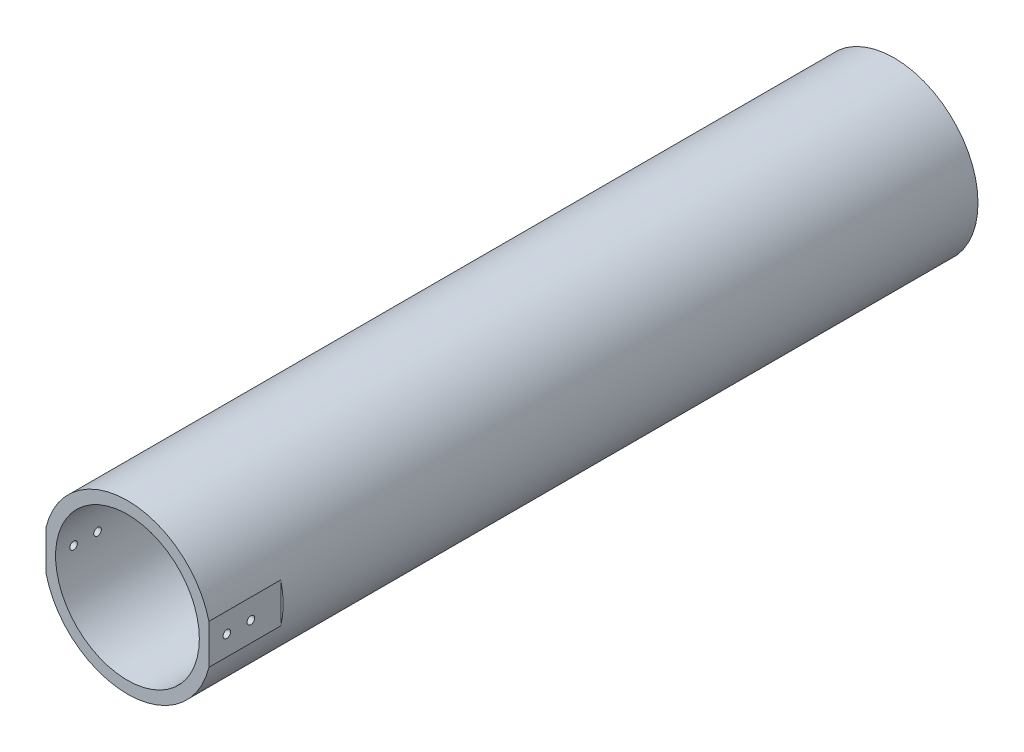
ISO-10303-21;
HEADER;
FILE_DESCRIPTION(('STEP AP214'),'2;1');
FILE_NAME('part.step','',(''),(''),'','','');
FILE_SCHEMA(('AUTOMOTIVE_DESIGN { 1 0 10303 214 1 1 1 1 }'));
ENDSEC;
DATA;
#1=APPLICATION_CONTEXT('core data for automotive mechanical design processes');
#2=APPLICATION_PROTOCOL_DEFINITION('international standard','automotive_design',2000,#1);
#3=PRODUCT_CONTEXT('',#1,'mechanical');
#4=PRODUCT('Part','Part','',(#3));
#5=PRODUCT_RELATED_PRODUCT_CATEGORY('part','',(#4));
#6=PRODUCT_DEFINITION_FORMATION('','',#4);
#7=PRODUCT_DEFINITION_CONTEXT('part definition',#1,'design');
#8=PRODUCT_DEFINITION('design','',#6,#7);
#9=PRODUCT_DEFINITION_SHAPE('','',#8);
#10=(LENGTH_UNIT() NAMED_UNIT(*) SI_UNIT(.MILLI.,.METRE.));
#11=(NAMED_UNIT(*) PLANE_ANGLE_UNIT() SI_UNIT($,.RADIAN.));
#12=(NAMED_UNIT(*) SI_UNIT($,.STERADIAN.) SOLID_ANGLE_UNIT());
#13=UNCERTAINTY_MEASURE_WITH_UNIT(LENGTH_MEASURE(1.E-05),#10,'distance_accuracy_value','');
#14=(GEOMETRIC_REPRESENTATION_CONTEXT(3) GLOBAL_UNCERTAINTY_ASSIGNED_CONTEXT((#13)) GLOBAL_UNIT_ASSIGNED_CONTEXT((#10,
#11,#12)) REPRESENTATION_CONTEXT('',''));
#15=CARTESIAN_POINT('',(0.,0.,0.));
#16=DIRECTION('',(0.,0.,1.));
#17=DIRECTION('',(1.,0.,0.));
#18=AXIS2_PLACEMENT_3D('',#15,#16,#17);
#19=CARTESIAN_POINT('',(0.,0.,203.2));
#20=DIRECTION('',(0.,0.,1.));
#21=DIRECTION('',(1.,0.,0.));
#22=AXIS2_PLACEMENT_3D('',#19,#20,#21);
#23=PLANE('',#22);
#24=CARTESIAN_POINT('',(0.,0.,203.2));
#25=DIRECTION('',(0.,0.,1.));
#26=DIRECTION('',(1.,0.,0.));
#27=AXIS2_PLACEMENT_3D('',#24,#25,#26);
#28=CIRCLE('',#27,38.1);
#29=CARTESIAN_POINT('',(38.1,0.,203.2));
#30=VERTEX_POINT('',#29);
#31=EDGE_CURVE('E122',#30,#30,#28,.T.);
#32=ORIENTED_EDGE('',*,*,#31,.F.);
#33=EDGE_LOOP('',(#32));
#34=FACE_BOUND('',#33,.T.);
#35=CARTESIAN_POINT('',(0.,0.,203.2));
#36=DIRECTION('',(0.,0.,1.));
#37=DIRECTION('',(1.,0.,0.));
#38=AXIS2_PLACEMENT_3D('',#35,#36,#37);
#39=CIRCLE('',#38,44.45);
#40=CARTESIAN_POINT('',(43.18,10.549412305906,203.2));
#41=VERTEX_POINT('',#40);
#42=CARTESIAN_POINT('',(-43.18,10.549412305906,203.2));
#43=VERTEX_POINT('',#42);
#44=EDGE_CURVE('E106',#41,#43,#39,.T.);
#45=ORIENTED_EDGE('',*,*,#44,.T.);
#46=DIRECTION('',(0.,-1.,0.));
#47=VECTOR('',#46,1.);
#48=CARTESIAN_POINT('',(-43.18,13.8245684323001,203.2));
#49=LINE('',#48,#47);
#50=CARTESIAN_POINT('',(-43.18,-10.5494123059059,203.2));
#51=VERTEX_POINT('',#50);
#52=EDGE_CURVE('E93',#43,#51,#49,.T.);
#53=ORIENTED_EDGE('',*,*,#52,.T.);
#54=CARTESIAN_POINT('',(43.18,-10.5494123059059,203.2));
#55=VERTEX_POINT('',#54);
#56=EDGE_CURVE('E112',#51,#55,#39,.T.);
#57=ORIENTED_EDGE('',*,*,#56,.T.);
#58=DIRECTION('',(0.,-1.,0.));
#59=VECTOR('',#58,1.);
#60=CARTESIAN_POINT('',(43.18,13.8245684323001,203.2));
#61=LINE('',#60,#59);
#62=EDGE_CURVE('E110',#41,#55,#61,.T.);
#63=ORIENTED_EDGE('',*,*,#62,.F.);
#64=EDGE_LOOP('',(#45,#53,#57,#63));
#65=FACE_BOUND('',#64,.T.);
#66=ADVANCED_FACE('F36',(#34,#65),#23,.T.);
#67=CARTESIAN_POINT('',(0.,0.,203.2));
#68=DIRECTION('',(0.,0.,-1.));
#69=DIRECTION('',(-1.,0.,0.));
#70=AXIS2_PLACEMENT_3D('',#67,#68,#69);
#71=CYLINDRICAL_SURFACE('',#70,44.45);
#72=CARTESIAN_POINT('',(0.,0.,-203.2));
#73=DIRECTION('',(0.,0.,1.));
#74=DIRECTION('',(1.,0.,0.));
#75=AXIS2_PLACEMENT_3D('',#72,#73,#74);
#76=CIRCLE('',#75,44.45);
#77=CARTESIAN_POINT('',(44.45,0.,-203.2));
#78=VERTEX_POINT('',#77);
#79=EDGE_CURVE('E116',#78,#78,#76,.T.);
#80=ORIENTED_EDGE('',*,*,#79,.T.);
#81=EDGE_LOOP('',(#80));
#82=FACE_BOUND('',#81,.T.);
#83=DIRECTION('',(0.,0.,-1.));
#84=VECTOR('',#83,1.);
#85=CARTESIAN_POINT('',(-43.18,10.549412305906,203.2));
#86=LINE('',#85,#84);
#87=CARTESIAN_POINT('',(-43.18,10.549412305906,165.1));
#88=VERTEX_POINT('',#87);
#89=EDGE_CURVE('E11',#43,#88,#86,.T.);
#90=ORIENTED_EDGE('',*,*,#89,.F.);
#91=ORIENTED_EDGE('',*,*,#44,.F.);
#92=DIRECTION('',(0.,0.,-1.));
#93=VECTOR('',#92,1.);
#94=CARTESIAN_POINT('',(43.18,10.549412305906,203.2));
#95=LINE('',#94,#93);
#96=CARTESIAN_POINT('',(43.18,10.549412305906,165.1));
#97=VERTEX_POINT('',#96);
#98=EDGE_CURVE('E126',#41,#97,#95,.T.);
#99=ORIENTED_EDGE('',*,*,#98,.T.);
#100=CARTESIAN_POINT('',(0.,0.,165.1));
#101=DIRECTION('',(0.,0.,1.));
#102=DIRECTION('',(1.,0.,0.));
#103=AXIS2_PLACEMENT_3D('',#100,#101,#102);
#104=CIRCLE('',#103,44.45);
#105=CARTESIAN_POINT('',(43.18,-10.5494123059059,165.1));
#106=VERTEX_POINT('',#105);
#107=EDGE_CURVE('E111',#106,#97,#104,.T.);
#108=ORIENTED_EDGE('',*,*,#107,.F.);
#109=DIRECTION('',(0.,0.,-1.));
#110=VECTOR('',#109,1.);
#111=CARTESIAN_POINT('',(43.18,-10.549412305906,203.2));
#112=LINE('',#111,#110);
#113=EDGE_CURVE('E114',#106,#55,#112,.F.);
#114=ORIENTED_EDGE('',*,*,#113,.T.);
#115=ORIENTED_EDGE('',*,*,#56,.F.);
#116=DIRECTION('',(0.,0.,-1.));
#117=VECTOR('',#116,1.);
#118=CARTESIAN_POINT('',(-43.18,-10.549412305906,203.2));
#119=LINE('',#118,#117);
#120=CARTESIAN_POINT('',(-43.18,-10.5494123059059,165.1));
#121=VERTEX_POINT('',#120);
#122=EDGE_CURVE('E49',#121,#51,#119,.F.);
#123=ORIENTED_EDGE('',*,*,#122,.F.);
#124=CARTESIAN_POINT('',(0.,0.,165.1));
#125=DIRECTION('',(0.,0.,1.));
#126=DIRECTION('',(1.,0.,0.));
#127=AXIS2_PLACEMENT_3D('',#124,#125,#126);
#128=CIRCLE('',#127,44.45);
#129=EDGE_CURVE('E107',#88,#121,#128,.T.);
#130=ORIENTED_EDGE('',*,*,#129,.F.);
#131=EDGE_LOOP('',(#90,#91,#99,#108,#114,#115,#123,#130));
#132=FACE_BOUND('',#131,.T.);
#133=ADVANCED_FACE('F38',(#82,#132),#71,.T.);
#134=CARTESIAN_POINT('',(0.,0.,-203.2));
#135=DIRECTION('',(0.,0.,1.));
#136=DIRECTION('',(1.,0.,0.));
#137=AXIS2_PLACEMENT_3D('',#134,#135,#136);
#138=PLANE('',#137);
#139=CARTESIAN_POINT('',(0.,41.275,-203.2));
#140=DIRECTION('',(0.,0.,-1.));
#141=DIRECTION('',(-1.,0.,0.));
#142=AXIS2_PLACEMENT_3D('',#139,#140,#141);
#143=CIRCLE('',#142,1.7272);
#144=CARTESIAN_POINT('',(-1.7272,41.275,-203.2));
#145=VERTEX_POINT('',#144);
#146=EDGE_CURVE('E178',#145,#145,#143,.T.);
#147=ORIENTED_EDGE('',*,*,#146,.F.);
#148=EDGE_LOOP('',(#147));
#149=FACE_BOUND('',#148,.T.);
#150=CARTESIAN_POINT('',(41.275,0.,-203.2));
#151=DIRECTION('',(0.,0.,-1.));
#152=DIRECTION('',(-1.,0.,0.));
#153=AXIS2_PLACEMENT_3D('',#150,#151,#152);
#154=CIRCLE('',#153,1.7272);
#155=CARTESIAN_POINT('',(39.5478,0.,-203.2));
#156=VERTEX_POINT('',#155);
#157=EDGE_CURVE('E182',#156,#156,#154,.T.);
#158=ORIENTED_EDGE('',*,*,#157,.F.);
#159=EDGE_LOOP('',(#158));
#160=FACE_BOUND('',#159,.T.);
#161=CARTESIAN_POINT('',(-41.275,0.,-203.2));
#162=DIRECTION('',(0.,0.,-1.));
#163=DIRECTION('',(-1.,0.,0.));
#164=AXIS2_PLACEMENT_3D('',#161,#162,#163);
#165=CIRCLE('',#164,1.7272);
#166=CARTESIAN_POINT('',(-43.0022,0.,-203.2));
#167=VERTEX_POINT('',#166);
#168=EDGE_CURVE('E186',#167,#167,#165,.T.);
#169=ORIENTED_EDGE('',*,*,#168,.F.);
#170=EDGE_LOOP('',(#169));
#171=FACE_BOUND('',#170,.T.);
#172=CARTESIAN_POINT('',(0.,-41.275,-203.2));
#173=DIRECTION('',(0.,0.,-1.));
#174=DIRECTION('',(-1.,0.,0.));
#175=AXIS2_PLACEMENT_3D('',#172,#173,#174);
#176=CIRCLE('',#175,1.7272);
#177=CARTESIAN_POINT('',(-1.7272,-41.275,-203.2));
#178=VERTEX_POINT('',#177);
#179=EDGE_CURVE('E190',#178,#178,#176,.T.);
#180=ORIENTED_EDGE('',*,*,#179,.F.);
#181=EDGE_LOOP('',(#180));
#182=FACE_BOUND('',#181,.T.);
#183=ORIENTED_EDGE('',*,*,#79,.F.);
#184=EDGE_LOOP('',(#183));
#185=FACE_BOUND('',#184,.T.);
#186=CARTESIAN_POINT('',(0.,0.,-203.2));
#187=DIRECTION('',(0.,0.,1.));
#188=DIRECTION('',(1.,0.,0.));
#189=AXIS2_PLACEMENT_3D('',#186,#187,#188);
#190=CIRCLE('',#189,38.1);
#191=CARTESIAN_POINT('',(38.1,0.,-203.2));
#192=VERTEX_POINT('',#191);
#193=EDGE_CURVE('E119',#192,#192,#190,.T.);
#194=ORIENTED_EDGE('',*,*,#193,.T.);
#195=EDGE_LOOP('',(#194));
#196=FACE_BOUND('',#195,.T.);
#197=ADVANCED_FACE('F160',(#149,#160,#171,#182,#185,#196),#138,.F.);
#198=CARTESIAN_POINT('',(0.,0.,203.2));
#199=DIRECTION('',(0.,0.,-1.));
#200=DIRECTION('',(-1.,0.,0.));
#201=AXIS2_PLACEMENT_3D('',#198,#199,#200);
#202=CYLINDRICAL_SURFACE('',#201,38.1);
#203=CARTESIAN_POINT('',(-38.1,0.,195.6943));
#204=CARTESIAN_POINT('',(-38.0999992850691,-0.113339598341558,195.694295001201));
#205=CARTESIAN_POINT('',(-38.0994888425181,-0.226759350218026,195.684725632485));
#206=CARTESIAN_POINT('',(-38.0975016581462,-0.450469361691122,195.64668759422));
#207=CARTESIAN_POINT('',(-38.0960237808714,-0.560755784880001,195.618196716395));
#208=CARTESIAN_POINT('',(-38.0922689796549,-0.774926152420234,195.543134249489));
#209=CARTESIAN_POINT('',(-38.0899924661331,-0.878813353161078,195.496571946021));
#210=CARTESIAN_POINT('',(-38.0848967067016,-1.07726933934862,195.386702804082));
#211=CARTESIAN_POINT('',(-38.0820775881113,-1.17184030294376,195.3233998924));
#212=CARTESIAN_POINT('',(-38.0762101748824,-1.34911289859955,195.18176807881));
#213=CARTESIAN_POINT('',(-38.0731616584123,-1.43180281077405,195.103424515795));
#214=CARTESIAN_POINT('',(-38.0671809436644,-1.58286606908075,194.933964831672));
#215=CARTESIAN_POINT('',(-38.0642487501657,-1.65123882747911,194.842848186473));
#216=CARTESIAN_POINT('',(-38.0588297263601,-1.77176033611551,194.650365916223));
#217=CARTESIAN_POINT('',(-38.0563431522437,-1.82389976629031,194.548994447641));
#218=CARTESIAN_POINT('',(-38.0520985250313,-1.91041482567791,194.338921183406));
#219=CARTESIAN_POINT('',(-38.0503404659014,-1.94479060202023,194.230219448476));
#220=CARTESIAN_POINT('',(-38.0477531587118,-1.99477113596519,194.008680593282));
#221=CARTESIAN_POINT('',(-38.0469230311444,-2.01039366921897,193.895847493752));
#222=CARTESIAN_POINT('',(-38.0462825606255,-2.02247910216299,193.669157552349));
#223=CARTESIAN_POINT('',(-38.0464722088574,-2.01894216749902,193.555300719335));
#224=CARTESIAN_POINT('',(-38.047849086287,-1.99282385748571,193.329916176919));
#225=CARTESIAN_POINT('',(-38.0490353091254,-1.97026169407589,193.218386234174));
#226=CARTESIAN_POINT('',(-38.0522700560462,-1.90676316206588,193.000698992353));
#227=CARTESIAN_POINT('',(-38.0543185841079,-1.86582670867355,192.894541718074));
#228=CARTESIAN_POINT('',(-38.0590482211504,-1.76671971997841,192.69055137019));
#229=CARTESIAN_POINT('',(-38.0617296511353,-1.70854043537146,192.592722555103));
#230=CARTESIAN_POINT('',(-38.0674225524442,-1.57660564607159,192.408212698326));
#231=CARTESIAN_POINT('',(-38.0704340264011,-1.50285001711756,192.321531745577));
#232=CARTESIAN_POINT('',(-38.0764520761202,-1.34174782107751,192.161666357165));
#233=CARTESIAN_POINT('',(-38.0794586412745,-1.25438461940654,192.08849868333));
#234=CARTESIAN_POINT('',(-38.0851244424745,-1.06860562701512,191.957866004619));
#235=CARTESIAN_POINT('',(-38.0877836784276,-0.970189833351248,191.900401003926));
#236=CARTESIAN_POINT('',(-38.09245526752,-0.765089434519909,191.802806457075));
#237=CARTESIAN_POINT('',(-38.0944675984227,-0.65840454526926,191.762677506807));
#238=CARTESIAN_POINT('',(-38.0976182737265,-0.439798738584252,191.70090518321));
#239=CARTESIAN_POINT('',(-38.0987566254752,-0.32787786517756,191.679261654474));
#240=CARTESIAN_POINT('',(-38.1000301077694,-0.102122608918278,191.655095237491));
#241=CARTESIAN_POINT('',(-38.1001664546494,0.0117092857633555,191.652549166748));
#242=CARTESIAN_POINT('',(-38.0994237918626,0.238183218599799,191.666589424538));
#243=CARTESIAN_POINT('',(-38.0985447859764,0.350825261183337,191.683175681834));
#244=CARTESIAN_POINT('',(-38.0958711941243,0.57165695930966,191.73499058353));
#245=CARTESIAN_POINT('',(-38.094077128595,0.67984910795567,191.770208631596));
#246=CARTESIAN_POINT('',(-38.0897753717232,0.888786672846725,191.858276657001));
#247=CARTESIAN_POINT('',(-38.087267675762,0.989532040889083,191.911126748459));
#248=CARTESIAN_POINT('',(-38.0818176581651,1.18082263710925,192.033017919383));
#249=CARTESIAN_POINT('',(-38.0788749207205,1.27135795904121,192.102074526408));
#250=CARTESIAN_POINT('',(-38.0728875669007,1.43955886696758,192.254395797363));
#251=CARTESIAN_POINT('',(-38.0698429497955,1.51722436072653,192.337660563112));
#252=CARTESIAN_POINT('',(-38.0639915118404,1.6575591284657,192.516134363348));
#253=CARTESIAN_POINT('',(-38.0611849307725,1.72021339434525,192.611355207701));
#254=CARTESIAN_POINT('',(-38.0561298341766,1.82864458936572,192.810978594158));
#255=CARTESIAN_POINT('',(-38.0538813159958,1.87442159872944,192.915381092617));
#256=CARTESIAN_POINT('',(-38.0501976197549,1.9477727096827,193.130348754239));
#257=CARTESIAN_POINT('',(-38.0487620154476,1.97535635212098,193.240910654286));
#258=CARTESIAN_POINT('',(-38.0468648421462,2.01156892567901,193.465104261071));
#259=CARTESIAN_POINT('',(-38.0464032667155,2.02019798205549,193.578735947519));
#260=CARTESIAN_POINT('',(-38.0465063599807,2.01825525459383,193.805694192574));
#261=CARTESIAN_POINT('',(-38.0470697669808,2.00770707686366,193.919020954578));
#262=CARTESIAN_POINT('',(-38.0491566596073,1.96775813502292,194.142292133366));
#263=CARTESIAN_POINT('',(-38.0506801470457,1.93835733533142,194.252236543766));
#264=CARTESIAN_POINT('',(-38.054515206927,1.8615426809272,194.465626690055));
#265=CARTESIAN_POINT('',(-38.056826783037,1.81412874239481,194.569072395702));
#266=CARTESIAN_POINT('',(-38.0619774305164,1.70263754510725,194.766537042002));
#267=CARTESIAN_POINT('',(-38.0648164862557,1.63856078007297,194.860556261848));
#268=CARTESIAN_POINT('',(-38.0707061319727,1.49547744933034,195.036617535547));
#269=CARTESIAN_POINT('',(-38.0737569553201,1.41645424169644,195.118646056272));
#270=CARTESIAN_POINT('',(-38.079724546096,1.24573568504467,195.268298914211));
#271=CARTESIAN_POINT('',(-38.0826412804012,1.15403722711618,195.33591970721));
#272=CARTESIAN_POINT('',(-38.0880142616383,0.960492104206841,195.454873179859));
#273=CARTESIAN_POINT('',(-38.0904700363288,0.858635193928371,195.506189192547));
#274=CARTESIAN_POINT('',(-38.0946375024046,0.64781408265201,195.590929779137));
#275=CARTESIAN_POINT('',(-38.0963500705864,0.538858431954179,195.624375446378));
#276=CARTESIAN_POINT('',(-38.0983861006478,0.357690072859563,195.66367063972));
#277=CARTESIAN_POINT('',(-38.0989886465776,0.286650311697344,195.67514194447));
#278=CARTESIAN_POINT('',(-38.0997958228029,0.143751116171477,195.690458206303));
#279=CARTESIAN_POINT('',(-38.100000453483,0.0718916826000702,195.694303170754));
#280=CARTESIAN_POINT('',(-38.1,0.,195.6943));
#281=B_SPLINE_CURVE_WITH_KNOTS('',3,(#203,#204,#205,#206,#207,#208,#209,#210,#211,#212,#213,
#214,#215,#216,#217,#218,#219,#220,#221,#222,#223,#224,#225,#226,#227,#228,#229,#230,#231,#232,
#233,#234,#235,#236,#237,#238,#239,#240,#241,#242,#243,#244,#245,#246,#247,#248,#249,#250,#251,
#252,#253,#254,#255,#256,#257,#258,#259,#260,#261,#262,#263,#264,#265,#266,#267,#268,#269,#270,
#271,#272,#273,#274,#275,#276,#277,#278,#279,#280),.UNSPECIFIED.,.T.,.F.,(4,2,2,2,2,2,2,2,2,2,2,
2,2,2,2,2,2,2,2,2,2,2,2,2,2,2,2,2,2,2,2,2,2,2,2,2,2,2,4),(0.,0.339756360106963,
0.679912200467916,1.01989348994496,1.35979510175187,1.70002973579934,2.04027833409045,
2.38072192107999,2.72116268826062,3.06128050613094,3.40139538347084,3.74116721882773,
4.0809406221514,4.42088672828459,4.76083554645862,5.10120324488629,5.44157103395733,
5.78195052148523,6.12232714738833,6.46229052149595,6.80225262978592,7.14202160120206,
7.48179277173541,7.82189081773082,8.16199130103488,8.50243040814991,8.84286789703195,
9.1831267136237,9.52338328169171,9.86322129640397,10.2030599525011,10.5429001899723,
10.8827303590975,11.2229411593103,11.5632355529794,11.9038766892382,12.2441148550288,
12.4596236477705,12.6751322322333),.UNSPECIFIED.);
#282=CARTESIAN_POINT('',(-38.1,0.,195.6943));
#283=VERTEX_POINT('',#282);
#284=EDGE_CURVE('E40',#283,#283,#281,.T.);
#285=ORIENTED_EDGE('',*,*,#284,.F.);
#286=EDGE_LOOP('',(#285));
#287=FACE_BOUND('',#286,.T.);
#288=CARTESIAN_POINT('',(-38.1,0.,182.9943));
#289=CARTESIAN_POINT('',(-38.0999992850691,-0.113339598341558,182.994295001201));
#290=CARTESIAN_POINT('',(-38.0994888425181,-0.226759350218026,182.984725632485));
#291=CARTESIAN_POINT('',(-38.0975016581462,-0.450469361691122,182.94668759422));
#292=CARTESIAN_POINT('',(-38.0960237808714,-0.560755784880001,182.918196716395));
#293=CARTESIAN_POINT('',(-38.0922689796549,-0.774926152420234,182.843134249489));
#294=CARTESIAN_POINT('',(-38.0899924661331,-0.878813353161078,182.796571946021));
#295=CARTESIAN_POINT('',(-38.0848967067016,-1.07726933934862,182.686702804082));
#296=CARTESIAN_POINT('',(-38.0820775881113,-1.17184030294376,182.6233998924));
#297=CARTESIAN_POINT('',(-38.0762101748824,-1.34911289859955,182.48176807881));
#298=CARTESIAN_POINT('',(-38.0731616584123,-1.43180281077405,182.403424515795));
#299=CARTESIAN_POINT('',(-38.0671809436644,-1.58286606908075,182.233964831672));
#300=CARTESIAN_POINT('',(-38.0642487501657,-1.65123882747911,182.142848186473));
#301=CARTESIAN_POINT('',(-38.0588297263601,-1.77176033611551,181.950365916223));
#302=CARTESIAN_POINT('',(-38.0563431522437,-1.82389976629031,181.848994447641));
#303=CARTESIAN_POINT('',(-38.0520985250313,-1.91041482567791,181.638921183406));
#304=CARTESIAN_POINT('',(-38.0503404659014,-1.94479060202023,181.530219448476));
#305=CARTESIAN_POINT('',(-38.0477531587118,-1.99477113596519,181.308680593282));
#306=CARTESIAN_POINT('',(-38.0469230311444,-2.01039366921897,181.195847493752));
#307=CARTESIAN_POINT('',(-38.0462825606255,-2.02247910216299,180.969157552349));
#308=CARTESIAN_POINT('',(-38.0464722088574,-2.01894216749902,180.855300719335));
#309=CARTESIAN_POINT('',(-38.047849086287,-1.99282385748571,180.629916176919));
#310=CARTESIAN_POINT('',(-38.0490353091254,-1.97026169407589,180.518386234174));
#311=CARTESIAN_POINT('',(-38.0522700560462,-1.90676316206588,180.300698992353));
#312=CARTESIAN_POINT('',(-38.0543185841079,-1.86582670867355,180.194541718074));
#313=CARTESIAN_POINT('',(-38.0590482211504,-1.76671971997842,179.99055137019));
#314=CARTESIAN_POINT('',(-38.0617296511353,-1.70854043537147,179.892722555103));
#315=CARTESIAN_POINT('',(-38.0674225524442,-1.57660564607161,179.708212698326));
#316=CARTESIAN_POINT('',(-38.0704340264011,-1.50285001711757,179.621531745577));
#317=CARTESIAN_POINT('',(-38.0764520761202,-1.3417478210775,179.461666357165));
#318=CARTESIAN_POINT('',(-38.0794586412745,-1.25438461940654,179.38849868333));
#319=CARTESIAN_POINT('',(-38.0851244424745,-1.06860562701512,179.257866004619));
#320=CARTESIAN_POINT('',(-38.0877836784276,-0.970189833351248,179.200401003926));
#321=CARTESIAN_POINT('',(-38.09245526752,-0.765089434519909,179.102806457075));
#322=CARTESIAN_POINT('',(-38.0944675984227,-0.65840454526926,179.062677506807));
#323=CARTESIAN_POINT('',(-38.0976182737265,-0.439798738584252,179.00090518321));
#324=CARTESIAN_POINT('',(-38.0987566254752,-0.32787786517756,178.979261654474));
#325=CARTESIAN_POINT('',(-38.1000301077694,-0.102122608918278,178.955095237491));
#326=CARTESIAN_POINT('',(-38.1001664546494,0.011709285763355,178.952549166748));
#327=CARTESIAN_POINT('',(-38.0994237918626,0.2381832185998,178.966589424538));
#328=CARTESIAN_POINT('',(-38.0985447859764,0.350825261183339,178.983175681834));
#329=CARTESIAN_POINT('',(-38.0958711941243,0.571656959309664,179.03499058353));
#330=CARTESIAN_POINT('',(-38.094077128595,0.679849107955674,179.070208631596));
#331=CARTESIAN_POINT('',(-38.0897753717232,0.888786672846729,179.158276657001));
#332=CARTESIAN_POINT('',(-38.087267675762,0.989532040889087,179.211126748459));
#333=CARTESIAN_POINT('',(-38.0818176581651,1.18082263710925,179.333017919383));
#334=CARTESIAN_POINT('',(-38.0788749207205,1.27135795904121,179.402074526408));
#335=CARTESIAN_POINT('',(-38.0728875669007,1.43955886696758,179.554395797363));
#336=CARTESIAN_POINT('',(-38.0698429497955,1.51722436072653,179.637660563112));
#337=CARTESIAN_POINT('',(-38.0639915118404,1.6575591284657,179.816134363348));
#338=CARTESIAN_POINT('',(-38.0611849307725,1.72021339434525,179.911355207701));
#339=CARTESIAN_POINT('',(-38.0561298341766,1.82864458936572,180.110978594158));
#340=CARTESIAN_POINT('',(-38.0538813159958,1.87442159872944,180.215381092617));
#341=CARTESIAN_POINT('',(-38.0501976197549,1.9477727096827,180.430348754239));
#342=CARTESIAN_POINT('',(-38.0487620154476,1.97535635212098,180.540910654286));
#343=CARTESIAN_POINT('',(-38.0468648421462,2.01156892567901,180.765104261071));
#344=CARTESIAN_POINT('',(-38.0464032667155,2.02019798205549,180.878735947519));
#345=CARTESIAN_POINT('',(-38.0465063599807,2.01825525459383,181.105694192574));
#346=CARTESIAN_POINT('',(-38.0470697669808,2.00770707686367,181.219020954578));
#347=CARTESIAN_POINT('',(-38.0491566596073,1.96775813502293,181.442292133366));
#348=CARTESIAN_POINT('',(-38.0506801470457,1.93835733533143,181.552236543766));
#349=CARTESIAN_POINT('',(-38.054515206927,1.86154268092721,181.765626690055));
#350=CARTESIAN_POINT('',(-38.056826783037,1.81412874239482,181.869072395702));
#351=CARTESIAN_POINT('',(-38.0619774305164,1.70263754510727,182.066537042002));
#352=CARTESIAN_POINT('',(-38.0648164862557,1.63856078007298,182.160556261848));
#353=CARTESIAN_POINT('',(-38.0707061319727,1.49547744933035,182.336617535547));
#354=CARTESIAN_POINT('',(-38.0737569553201,1.41645424169644,182.418646056272));
#355=CARTESIAN_POINT('',(-38.079724546096,1.24573568504467,182.568298914211));
#356=CARTESIAN_POINT('',(-38.0826412804012,1.15403722711618,182.63591970721));
#357=CARTESIAN_POINT('',(-38.0880142616383,0.960492104206841,182.754873179859));
#358=CARTESIAN_POINT('',(-38.0904700363288,0.858635193928371,182.806189192547));
#359=CARTESIAN_POINT('',(-38.0946375024046,0.64781408265201,182.890929779137));
#360=CARTESIAN_POINT('',(-38.0963500705864,0.538858431954179,182.924375446378));
#361=CARTESIAN_POINT('',(-38.0983861006478,0.357690072859562,182.96367063972));
#362=CARTESIAN_POINT('',(-38.0989886465776,0.286650311697342,182.97514194447));
#363=CARTESIAN_POINT('',(-38.0997958228029,0.143751116171475,182.990458206303));
#364=CARTESIAN_POINT('',(-38.100000453483,0.0718916826000692,182.994303170754));
#365=CARTESIAN_POINT('',(-38.1,0.,182.9943));
#366=B_SPLINE_CURVE_WITH_KNOTS('',3,(#288,#289,#290,#291,#292,#293,#294,#295,#296,#297,#298,
#299,#300,#301,#302,#303,#304,#305,#306,#307,#308,#309,#310,#311,#312,#313,#314,#315,#316,#317,
#318,#319,#320,#321,#322,#323,#324,#325,#326,#327,#328,#329,#330,#331,#332,#333,#334,#335,#336,
#337,#338,#339,#340,#341,#342,#343,#344,#345,#346,#347,#348,#349,#350,#351,#352,#353,#354,#355,
#356,#357,#358,#359,#360,#361,#362,#363,#364,#365),.UNSPECIFIED.,.T.,.F.,(4,2,2,2,2,2,2,2,2,2,2,
2,2,2,2,2,2,2,2,2,2,2,2,2,2,2,2,2,2,2,2,2,2,2,2,2,2,2,4),(0.,0.339756360106963,
0.679912200467916,1.01989348994496,1.35979510175187,1.70002973579934,2.04027833409045,
2.38072192107999,2.72116268826062,3.06128050613094,3.40139538347084,3.74116721882773,
4.0809406221514,4.42088672828456,4.76083554645862,5.10120324488629,5.44157103395733,
5.78195052148523,6.12232714738833,6.46229052149595,6.80225262978592,7.14202160120207,
7.48179277173541,7.82189081773082,8.16199130103487,8.50243040814991,8.84286789703195,
9.1831267136237,9.5233832816917,9.86322129640391,10.2030599525011,10.5429001899723,
10.8827303590975,11.2229411593103,11.5632355529793,11.9038766892382,12.2441148550288,
12.4596236477705,12.6751322322333),.UNSPECIFIED.);
#367=CARTESIAN_POINT('',(-38.1,0.,182.9943));
#368=VERTEX_POINT('',#367);
#369=EDGE_CURVE('E101',#368,#368,#366,.T.);
#370=ORIENTED_EDGE('',*,*,#369,.F.);
#371=EDGE_LOOP('',(#370));
#372=FACE_BOUND('',#371,.T.);
#373=CARTESIAN_POINT('',(38.1,0.,191.6557));
#374=CARTESIAN_POINT('',(38.0999992850691,-0.113339598341547,191.655704998799));
#375=CARTESIAN_POINT('',(38.0994888425181,-0.226759350218015,191.665274367515));
#376=CARTESIAN_POINT('',(38.0975016581462,-0.45046936169111,191.70331240578));
#377=CARTESIAN_POINT('',(38.0960237808714,-0.56075578487999,191.731803283605));
#378=CARTESIAN_POINT('',(38.0922689796549,-0.774926152420224,191.806865750511));
#379=CARTESIAN_POINT('',(38.0899924661331,-0.878813353161067,191.853428053979));
#380=CARTESIAN_POINT('',(38.0848967067016,-1.07726933934862,191.963297195918));
#381=CARTESIAN_POINT('',(38.0820775881113,-1.17184030294376,192.0266001076));
#382=CARTESIAN_POINT('',(38.0762101748824,-1.34911289859954,192.16823192119));
#383=CARTESIAN_POINT('',(38.0731616584123,-1.43180281077402,192.246575484205));
#384=CARTESIAN_POINT('',(38.0671809436644,-1.58286606908072,192.416035168328));
#385=CARTESIAN_POINT('',(38.0642487501657,-1.65123882747909,192.507151813527));
#386=CARTESIAN_POINT('',(38.0588297263601,-1.7717603361155,192.699634083777));
#387=CARTESIAN_POINT('',(38.0563431522437,-1.82389976629031,192.801005552359));
#388=CARTESIAN_POINT('',(38.0520985250313,-1.9104148256779,193.011078816594));
#389=CARTESIAN_POINT('',(38.0503404659014,-1.94479060202023,193.119780551524));
#390=CARTESIAN_POINT('',(38.0477531587118,-1.99477113596519,193.341319406718));
#391=CARTESIAN_POINT('',(38.0469230311444,-2.01039366921897,193.454152506248));
#392=CARTESIAN_POINT('',(38.0462825606255,-2.02247910216299,193.680842447651));
#393=CARTESIAN_POINT('',(38.0464722088574,-2.01894216749902,193.794699280665));
#394=CARTESIAN_POINT('',(38.047849086287,-1.99282385748571,194.020083823081));
#395=CARTESIAN_POINT('',(38.0490353091254,-1.97026169407589,194.131613765826));
#396=CARTESIAN_POINT('',(38.0522700560462,-1.90676316206588,194.349301007647));
#397=CARTESIAN_POINT('',(38.0543185841079,-1.86582670867355,194.455458281926));
#398=CARTESIAN_POINT('',(38.0590482211504,-1.76671971997842,194.65944862981));
#399=CARTESIAN_POINT('',(38.0617296511353,-1.70854043537146,194.757277444897));
#400=CARTESIAN_POINT('',(38.0674225524442,-1.57660564607159,194.941787301674));
#401=CARTESIAN_POINT('',(38.0704340264011,-1.50285001711756,195.028468254423));
#402=CARTESIAN_POINT('',(38.0764520761202,-1.34174782107751,195.188333642835));
#403=CARTESIAN_POINT('',(38.0794586412745,-1.25438461940655,195.26150131667));
#404=CARTESIAN_POINT('',(38.0851244424745,-1.06860562701513,195.392133995381));
#405=CARTESIAN_POINT('',(38.0877836784276,-0.970189833351263,195.449598996074));
#406=CARTESIAN_POINT('',(38.09245526752,-0.76508943451993,195.547193542925));
#407=CARTESIAN_POINT('',(38.0944675984227,-0.658404545269284,195.587322493193));
#408=CARTESIAN_POINT('',(38.0976182737265,-0.439798738584272,195.64909481679));
#409=CARTESIAN_POINT('',(38.0987566254752,-0.327877865177573,195.670738345526));
#410=CARTESIAN_POINT('',(38.1000301077694,-0.102122608918286,195.694904762509));
#411=CARTESIAN_POINT('',(38.1001664546494,0.0117092857633441,195.697450833252));
#412=CARTESIAN_POINT('',(38.0994237918626,0.238183218599788,195.683410575462));
#413=CARTESIAN_POINT('',(38.0985447859764,0.350825261183327,195.666824318166));
#414=CARTESIAN_POINT('',(38.0958711941243,0.571656959309646,195.61500941647));
#415=CARTESIAN_POINT('',(38.094077128595,0.679849107955649,195.579791368404));
#416=CARTESIAN_POINT('',(38.0897753717232,0.888786672846704,195.491723342999));
#417=CARTESIAN_POINT('',(38.087267675762,0.989532040889069,195.438873251541));
#418=CARTESIAN_POINT('',(38.0818176581651,1.18082263710924,195.316982080617));
#419=CARTESIAN_POINT('',(38.0788749207205,1.2713579590412,195.247925473592));
#420=CARTESIAN_POINT('',(38.0728875669007,1.43955886696757,195.095604202637));
#421=CARTESIAN_POINT('',(38.0698429497955,1.51722436072652,195.012339436888));
#422=CARTESIAN_POINT('',(38.0639915118404,1.65755912846569,194.833865636652));
#423=CARTESIAN_POINT('',(38.0611849307725,1.72021339434525,194.738644792299));
#424=CARTESIAN_POINT('',(38.0561298341766,1.82864458936572,194.539021405842));
#425=CARTESIAN_POINT('',(38.0538813159958,1.87442159872944,194.434618907383));
#426=CARTESIAN_POINT('',(38.0501976197549,1.9477727096827,194.219651245761));
#427=CARTESIAN_POINT('',(38.0487620154476,1.97535635212098,194.109089345714));
#428=CARTESIAN_POINT('',(38.0468648421462,2.011568925679,193.884895738929));
#429=CARTESIAN_POINT('',(38.0464032667155,2.02019798205549,193.771264052481));
#430=CARTESIAN_POINT('',(38.0465063599807,2.01825525459383,193.544305807426));
#431=CARTESIAN_POINT('',(38.0470697669808,2.00770707686367,193.430979045422));
#432=CARTESIAN_POINT('',(38.0491566596073,1.96775813502294,193.207707866634));
#433=CARTESIAN_POINT('',(38.0506801470457,1.93835733533144,193.097763456234));
#434=CARTESIAN_POINT('',(38.054515206927,1.86154268092721,192.884373309945));
#435=CARTESIAN_POINT('',(38.056826783037,1.81412874239482,192.780927604298));
#436=CARTESIAN_POINT('',(38.0619774305164,1.70263754510727,192.583462957998));
#437=CARTESIAN_POINT('',(38.0648164862557,1.63856078007298,192.489443738152));
#438=CARTESIAN_POINT('',(38.0707061319727,1.49547744933035,192.313382464453));
#439=CARTESIAN_POINT('',(38.0737569553201,1.41645424169644,192.231353943728));
#440=CARTESIAN_POINT('',(38.079724546096,1.24573568504467,192.081701085789));
#441=CARTESIAN_POINT('',(38.0826412804012,1.15403722711618,192.01408029279));
#442=CARTESIAN_POINT('',(38.0880142616383,0.960492104206845,191.895126820141));
#443=CARTESIAN_POINT('',(38.0904700363288,0.858635193928377,191.843810807453));
#444=CARTESIAN_POINT('',(38.0946375024046,0.647814082652023,191.759070220863));
#445=CARTESIAN_POINT('',(38.0963500705864,0.538858431954196,191.725624553622));
#446=CARTESIAN_POINT('',(38.0983861006478,0.357690072859581,191.68632936028));
#447=CARTESIAN_POINT('',(38.0989886465776,0.286650311697362,191.67485805553));
#448=CARTESIAN_POINT('',(38.0997958228029,0.143751116171491,191.659541793697));
#449=CARTESIAN_POINT('',(38.100000453483,0.0718916826000824,191.655696829245));
#450=CARTESIAN_POINT('',(38.1,0.,191.6557));
#451=B_SPLINE_CURVE_WITH_KNOTS('',3,(#373,#374,#375,#376,#377,#378,#379,#380,#381,#382,#383,
#384,#385,#386,#387,#388,#389,#390,#391,#392,#393,#394,#395,#396,#397,#398,#399,#400,#401,#402,
#403,#404,#405,#406,#407,#408,#409,#410,#411,#412,#413,#414,#415,#416,#417,#418,#419,#420,#421,
#422,#423,#424,#425,#426,#427,#428,#429,#430,#431,#432,#433,#434,#435,#436,#437,#438,#439,#440,
#441,#442,#443,#444,#445,#446,#447,#448,#449,#450),.UNSPECIFIED.,.T.,.F.,(4,2,2,2,2,2,2,2,2,2,2,
2,2,2,2,2,2,2,2,2,2,2,2,2,2,2,2,2,2,2,2,2,2,2,2,2,2,2,4),(0.,0.339756360106961,
0.679912200467916,1.01989348994497,1.35979510175186,1.70002973579931,2.04027833409043,
2.38072192108,2.72116268826063,3.06128050613095,3.40139538347085,3.74116721882774,
4.08094062215141,4.42088672828461,4.76083554645863,5.10120324488629,5.44157103395731,
5.78195052148522,6.12232714738833,6.46229052149595,6.80225262978592,7.14202160120205,
7.4817927717354,7.82189081773081,8.16199130103489,8.50243040814992,8.84286789703197,
9.18312671362369,9.5233832816917,9.86322129640393,10.203059952501,10.5429001899723,
10.8827303590975,11.2229411593103,11.5632355529794,11.9038766892382,12.2441148550288,
12.4596236477705,12.6751322322333),.UNSPECIFIED.);
#452=CARTESIAN_POINT('',(38.1,0.,191.6557));
#453=VERTEX_POINT('',#452);
#454=EDGE_CURVE('E135',#453,#453,#451,.T.);
#455=ORIENTED_EDGE('',*,*,#454,.F.);
#456=EDGE_LOOP('',(#455));
#457=FACE_BOUND('',#456,.T.);
#458=CARTESIAN_POINT('',(38.1,0.,178.9557));
#459=CARTESIAN_POINT('',(38.0999992850691,-0.113339598341547,178.955704998799));
#460=CARTESIAN_POINT('',(38.0994888425181,-0.226759350218015,178.965274367515));
#461=CARTESIAN_POINT('',(38.0975016581462,-0.45046936169111,179.00331240578));
#462=CARTESIAN_POINT('',(38.0960237808714,-0.56075578487999,179.031803283605));
#463=CARTESIAN_POINT('',(38.0922689796549,-0.774926152420224,179.106865750511));
#464=CARTESIAN_POINT('',(38.0899924661331,-0.878813353161067,179.153428053979));
#465=CARTESIAN_POINT('',(38.0848967067016,-1.07726933934862,179.263297195918));
#466=CARTESIAN_POINT('',(38.0820775881113,-1.17184030294376,179.3266001076));
#467=CARTESIAN_POINT('',(38.0762101748824,-1.34911289859954,179.46823192119));
#468=CARTESIAN_POINT('',(38.0731616584123,-1.43180281077402,179.546575484205));
#469=CARTESIAN_POINT('',(38.0671809436644,-1.58286606908072,179.716035168328));
#470=CARTESIAN_POINT('',(38.0642487501657,-1.65123882747909,179.807151813527));
#471=CARTESIAN_POINT('',(38.0588297263601,-1.7717603361155,179.999634083777));
#472=CARTESIAN_POINT('',(38.0563431522437,-1.82389976629031,180.101005552359));
#473=CARTESIAN_POINT('',(38.0520985250313,-1.9104148256779,180.311078816594));
#474=CARTESIAN_POINT('',(38.0503404659014,-1.94479060202023,180.419780551524));
#475=CARTESIAN_POINT('',(38.0477531587118,-1.99477113596519,180.641319406718));
#476=CARTESIAN_POINT('',(38.0469230311444,-2.01039366921897,180.754152506248));
#477=CARTESIAN_POINT('',(38.0462825606255,-2.02247910216299,180.980842447651));
#478=CARTESIAN_POINT('',(38.0464722088574,-2.01894216749902,181.094699280665));
#479=CARTESIAN_POINT('',(38.047849086287,-1.99282385748571,181.320083823081));
#480=CARTESIAN_POINT('',(38.0490353091254,-1.97026169407589,181.431613765826));
#481=CARTESIAN_POINT('',(38.0522700560462,-1.90676316206588,181.649301007647));
#482=CARTESIAN_POINT('',(38.0543185841079,-1.86582670867355,181.755458281926));
#483=CARTESIAN_POINT('',(38.0590482211504,-1.76671971997842,181.95944862981));
#484=CARTESIAN_POINT('',(38.0617296511353,-1.70854043537146,182.057277444897));
#485=CARTESIAN_POINT('',(38.0674225524442,-1.5766056460716,182.241787301674));
#486=CARTESIAN_POINT('',(38.0704340264011,-1.50285001711756,182.328468254423));
#487=CARTESIAN_POINT('',(38.0764520761202,-1.34174782107751,182.488333642835));
#488=CARTESIAN_POINT('',(38.0794586412745,-1.25438461940655,182.56150131667));
#489=CARTESIAN_POINT('',(38.0851244424745,-1.06860562701513,182.692133995381));
#490=CARTESIAN_POINT('',(38.0877836784276,-0.970189833351262,182.749598996074));
#491=CARTESIAN_POINT('',(38.09245526752,-0.765089434519932,182.847193542925));
#492=CARTESIAN_POINT('',(38.0944675984227,-0.658404545269289,182.887322493193));
#493=CARTESIAN_POINT('',(38.0976182737265,-0.439798738584277,182.94909481679));
#494=CARTESIAN_POINT('',(38.0987566254752,-0.327877865177576,182.970738345526));
#495=CARTESIAN_POINT('',(38.1000301077694,-0.102122608918286,182.994904762509));
#496=CARTESIAN_POINT('',(38.1001664546494,0.0117092857633441,182.997450833252));
#497=CARTESIAN_POINT('',(38.0994237918626,0.238183218599788,182.983410575462));
#498=CARTESIAN_POINT('',(38.0985447859764,0.350825261183327,182.966824318166));
#499=CARTESIAN_POINT('',(38.0958711941243,0.571656959309646,182.91500941647));
#500=CARTESIAN_POINT('',(38.094077128595,0.679849107955649,182.879791368404));
#501=CARTESIAN_POINT('',(38.0897753717232,0.888786672846704,182.791723342999));
#502=CARTESIAN_POINT('',(38.087267675762,0.989532040889069,182.738873251541));
#503=CARTESIAN_POINT('',(38.0818176581651,1.18082263710924,182.616982080617));
#504=CARTESIAN_POINT('',(38.0788749207205,1.2713579590412,182.547925473592));
#505=CARTESIAN_POINT('',(38.0728875669007,1.43955886696757,182.395604202637));
#506=CARTESIAN_POINT('',(38.0698429497955,1.51722436072652,182.312339436888));
#507=CARTESIAN_POINT('',(38.0639915118404,1.65755912846569,182.133865636652));
#508=CARTESIAN_POINT('',(38.0611849307725,1.72021339434525,182.038644792299));
#509=CARTESIAN_POINT('',(38.0561298341766,1.82864458936572,181.839021405842));
#510=CARTESIAN_POINT('',(38.0538813159958,1.87442159872944,181.734618907383));
#511=CARTESIAN_POINT('',(38.0501976197549,1.9477727096827,181.519651245761));
#512=CARTESIAN_POINT('',(38.0487620154476,1.97535635212098,181.409089345714));
#513=CARTESIAN_POINT('',(38.0468648421462,2.011568925679,181.184895738929));
#514=CARTESIAN_POINT('',(38.0464032667155,2.02019798205549,181.071264052481));
#515=CARTESIAN_POINT('',(38.0465063599807,2.01825525459383,180.844305807426));
#516=CARTESIAN_POINT('',(38.0470697669808,2.00770707686367,180.730979045422));
#517=CARTESIAN_POINT('',(38.0491566596073,1.96775813502294,180.507707866634));
#518=CARTESIAN_POINT('',(38.0506801470457,1.93835733533144,180.397763456234));
#519=CARTESIAN_POINT('',(38.054515206927,1.86154268092721,180.184373309945));
#520=CARTESIAN_POINT('',(38.056826783037,1.81412874239482,180.080927604298));
#521=CARTESIAN_POINT('',(38.0619774305164,1.70263754510727,179.883462957998));
#522=CARTESIAN_POINT('',(38.0648164862557,1.63856078007298,179.789443738152));
#523=CARTESIAN_POINT('',(38.0707061319727,1.49547744933035,179.613382464453));
#524=CARTESIAN_POINT('',(38.0737569553201,1.41645424169644,179.531353943728));
#525=CARTESIAN_POINT('',(38.079724546096,1.24573568504467,179.381701085789));
#526=CARTESIAN_POINT('',(38.0826412804012,1.15403722711618,179.31408029279));
#527=CARTESIAN_POINT('',(38.0880142616383,0.960492104206845,179.195126820141));
#528=CARTESIAN_POINT('',(38.0904700363288,0.858635193928377,179.143810807453));
#529=CARTESIAN_POINT('',(38.0946375024046,0.647814082652023,179.059070220863));
#530=CARTESIAN_POINT('',(38.0963500705864,0.538858431954196,179.025624553622));
#531=CARTESIAN_POINT('',(38.0983861006478,0.35769007285958,178.98632936028));
#532=CARTESIAN_POINT('',(38.0989886465776,0.28665031169736,178.97485805553));
#533=CARTESIAN_POINT('',(38.0997958228029,0.143751116171489,178.959541793697));
#534=CARTESIAN_POINT('',(38.100000453483,0.0718916826000814,178.955696829246));
#535=CARTESIAN_POINT('',(38.1,0.,178.9557));
#536=B_SPLINE_CURVE_WITH_KNOTS('',3,(#458,#459,#460,#461,#462,#463,#464,#465,#466,#467,#468,
#469,#470,#471,#472,#473,#474,#475,#476,#477,#478,#479,#480,#481,#482,#483,#484,#485,#486,#487,
#488,#489,#490,#491,#492,#493,#494,#495,#496,#497,#498,#499,#500,#501,#502,#503,#504,#505,#506,
#507,#508,#509,#510,#511,#512,#513,#514,#515,#516,#517,#518,#519,#520,#521,#522,#523,#524,#525,
#526,#527,#528,#529,#530,#531,#532,#533,#534,#535),.UNSPECIFIED.,.T.,.F.,(4,2,2,2,2,2,2,2,2,2,2,
2,2,2,2,2,2,2,2,2,2,2,2,2,2,2,2,2,2,2,2,2,2,2,2,2,2,2,4),(0.,0.339756360106961,
0.679912200467916,1.01989348994497,1.35979510175186,1.70002973579931,2.04027833409043,
2.38072192108,2.72116268826063,3.06128050613095,3.40139538347085,3.74116721882774,
4.08094062215141,4.42088672828457,4.76083554645863,5.10120324488629,5.4415710339573,
5.78195052148521,6.12232714738833,6.46229052149595,6.80225262978591,7.14202160120205,
7.4817927717354,7.82189081773081,8.16199130103489,8.50243040814992,8.84286789703197,
9.18312671362369,9.5233832816917,9.86322129640392,10.203059952501,10.5429001899723,
10.8827303590975,11.2229411593103,11.5632355529794,11.9038766892382,12.2441148550288,
12.4596236477705,12.6751322322333),.UNSPECIFIED.);
#537=CARTESIAN_POINT('',(38.1,0.,178.9557));
#538=VERTEX_POINT('',#537);
#539=EDGE_CURVE('E128',#538,#538,#536,.T.);
#540=ORIENTED_EDGE('',*,*,#539,.F.);
#541=EDGE_LOOP('',(#540));
#542=FACE_BOUND('',#541,.T.);
#543=ORIENTED_EDGE('',*,*,#31,.T.);
#544=EDGE_LOOP('',(#543));
#545=FACE_BOUND('',#544,.T.);
#546=ORIENTED_EDGE('',*,*,#193,.F.);
#547=EDGE_LOOP('',(#546));
#548=FACE_BOUND('',#547,.T.);
#549=ADVANCED_FACE('F140',(#287,#372,#457,#542,#545,#548),#202,.F.);
#550=CARTESIAN_POINT('',(43.18,13.8245684323001,165.1));
#551=DIRECTION('',(-1.,0.,0.));
#552=DIRECTION('',(0.,-1.,0.));
#553=AXIS2_PLACEMENT_3D('',#550,#551,#552);
#554=PLANE('',#553);
#555=CARTESIAN_POINT('',(43.18,0.,193.675));
#556=DIRECTION('',(1.,0.,0.));
#557=DIRECTION('',(0.,0.,-1.));
#558=AXIS2_PLACEMENT_3D('',#555,#556,#557);
#559=CIRCLE('',#558,2.0193);
#560=CARTESIAN_POINT('',(43.18,0.,191.6557));
#561=VERTEX_POINT('',#560);
#562=EDGE_CURVE('E202',#561,#561,#559,.T.);
#563=ORIENTED_EDGE('',*,*,#562,.F.);
#564=EDGE_LOOP('',(#563));
#565=FACE_BOUND('',#564,.T.);
#566=CARTESIAN_POINT('',(43.18,0.,180.975));
#567=DIRECTION('',(1.,0.,0.));
#568=DIRECTION('',(0.,0.,-1.));
#569=AXIS2_PLACEMENT_3D('',#566,#567,#568);
#570=CIRCLE('',#569,2.0193);
#571=CARTESIAN_POINT('',(43.18,0.,178.9557));
#572=VERTEX_POINT('',#571);
#573=EDGE_CURVE('E134',#572,#572,#570,.T.);
#574=ORIENTED_EDGE('',*,*,#573,.F.);
#575=EDGE_LOOP('',(#574));
#576=FACE_BOUND('',#575,.T.);
#577=ORIENTED_EDGE('',*,*,#62,.T.);
#578=ORIENTED_EDGE('',*,*,#113,.F.);
#579=DIRECTION('',(0.,-1.,0.));
#580=VECTOR('',#579,1.);
#581=CARTESIAN_POINT('',(43.18,13.8245684323001,165.1));
#582=LINE('',#581,#580);
#583=EDGE_CURVE('E62',#97,#106,#582,.T.);
#584=ORIENTED_EDGE('',*,*,#583,.F.);
#585=ORIENTED_EDGE('',*,*,#98,.F.);
#586=EDGE_LOOP('',(#577,#578,#584,#585));
#587=FACE_BOUND('',#586,.T.);
#588=ADVANCED_FACE('F154',(#565,#576,#587),#554,.F.);
#589=CARTESIAN_POINT('',(0.,0.,165.1));
#590=DIRECTION('',(0.,0.,1.));
#591=DIRECTION('',(1.,0.,0.));
#592=AXIS2_PLACEMENT_3D('',#589,#590,#591);
#593=PLANE('',#592);
#594=ORIENTED_EDGE('',*,*,#107,.T.);
#595=ORIENTED_EDGE('',*,*,#583,.T.);
#596=EDGE_LOOP('',(#594,#595));
#597=FACE_BOUND('',#596,.T.);
#598=ADVANCED_FACE('F149',(#597),#593,.T.);
#599=CARTESIAN_POINT('',(43.18,0.,180.975));
#600=DIRECTION('',(1.,0.,0.));
#601=DIRECTION('',(0.,0.,-1.));
#602=AXIS2_PLACEMENT_3D('',#599,#600,#601);
#603=CYLINDRICAL_SURFACE('',#602,2.0193);
#604=ORIENTED_EDGE('',*,*,#539,.T.);
#605=EDGE_LOOP('',(#604));
#606=FACE_BOUND('',#605,.T.);
#607=ORIENTED_EDGE('',*,*,#573,.T.);
#608=EDGE_LOOP('',(#607));
#609=FACE_BOUND('',#608,.T.);
#610=ADVANCED_FACE('F144',(#606,#609),#603,.F.);
#611=CARTESIAN_POINT('',(43.18,0.,193.675));
#612=DIRECTION('',(1.,0.,0.));
#613=DIRECTION('',(0.,0.,-1.));
#614=AXIS2_PLACEMENT_3D('',#611,#612,#613);
#615=CYLINDRICAL_SURFACE('',#614,2.0193);
#616=ORIENTED_EDGE('',*,*,#454,.T.);
#617=EDGE_LOOP('',(#616));
#618=FACE_BOUND('',#617,.T.);
#619=ORIENTED_EDGE('',*,*,#562,.T.);
#620=EDGE_LOOP('',(#619));
#621=FACE_BOUND('',#620,.T.);
#622=ADVANCED_FACE('F148',(#618,#621),#615,.F.);
#623=CARTESIAN_POINT('',(0.,-41.275,-188.214));
#624=DIRECTION('',(0.,0.,-1.));
#625=DIRECTION('',(-1.,0.,0.));
#626=AXIS2_PLACEMENT_3D('',#623,#624,#625);
#627=CONICAL_SURFACE('',#626,1.7272,1.02974425867665);
#628=CARTESIAN_POINT('',(0.,-41.275,-187.176193538816));
#629=VERTEX_POINT('',#628);
#630=VERTEX_LOOP('',#629);
#631=FACE_BOUND('',#630,.T.);
#632=CARTESIAN_POINT('',(0.,-41.275,-188.214));
#633=DIRECTION('',(0.,0.,-1.));
#634=DIRECTION('',(-1.,0.,0.));
#635=AXIS2_PLACEMENT_3D('',#632,#633,#634);
#636=CIRCLE('',#635,1.7272);
#637=CARTESIAN_POINT('',(-1.7272,-41.275,-188.214));
#638=VERTEX_POINT('',#637);
#639=EDGE_CURVE('E205',#638,#638,#636,.T.);
#640=ORIENTED_EDGE('',*,*,#639,.T.);
#641=EDGE_LOOP('',(#640));
#642=FACE_BOUND('',#641,.T.);
#643=ADVANCED_FACE('F288',(#631,#642),#627,.F.);
#644=CARTESIAN_POINT('',(0.,-41.275,-203.2));
#645=DIRECTION('',(0.,0.,-1.));
#646=DIRECTION('',(-1.,0.,0.));
#647=AXIS2_PLACEMENT_3D('',#644,#645,#646);
#648=CYLINDRICAL_SURFACE('',#647,1.7272);
#649=ORIENTED_EDGE('',*,*,#639,.F.);
#650=EDGE_LOOP('',(#649));
#651=FACE_BOUND('',#650,.T.);
#652=ORIENTED_EDGE('',*,*,#179,.T.);
#653=EDGE_LOOP('',(#652));
#654=FACE_BOUND('',#653,.T.);
#655=ADVANCED_FACE('F285',(#651,#654),#648,.F.);
#656=CARTESIAN_POINT('',(-41.275,0.,-188.214));
#657=DIRECTION('',(0.,0.,-1.));
#658=DIRECTION('',(-1.,0.,0.));
#659=AXIS2_PLACEMENT_3D('',#656,#657,#658);
#660=CONICAL_SURFACE('',#659,1.7272,1.02974425867665);
#661=CARTESIAN_POINT('',(-41.275,0.,-187.176193538816));
#662=VERTEX_POINT('',#661);
#663=VERTEX_LOOP('',#662);
#664=FACE_BOUND('',#663,.T.);
#665=CARTESIAN_POINT('',(-41.275,0.,-188.214));
#666=DIRECTION('',(0.,0.,-1.));
#667=DIRECTION('',(-1.,0.,0.));
#668=AXIS2_PLACEMENT_3D('',#665,#666,#667);
#669=CIRCLE('',#668,1.7272);
#670=CARTESIAN_POINT('',(-43.0022,0.,-188.214));
#671=VERTEX_POINT('',#670);
#672=EDGE_CURVE('E209',#671,#671,#669,.T.);
#673=ORIENTED_EDGE('',*,*,#672,.T.);
#674=EDGE_LOOP('',(#673));
#675=FACE_BOUND('',#674,.T.);
#676=ADVANCED_FACE('F281',(#664,#675),#660,.F.);
#677=CARTESIAN_POINT('',(-41.275,0.,-203.2));
#678=DIRECTION('',(0.,0.,-1.));
#679=DIRECTION('',(-1.,0.,0.));
#680=AXIS2_PLACEMENT_3D('',#677,#678,#679);
#681=CYLINDRICAL_SURFACE('',#680,1.7272);
#682=ORIENTED_EDGE('',*,*,#672,.F.);
#683=EDGE_LOOP('',(#682));
#684=FACE_BOUND('',#683,.T.);
#685=ORIENTED_EDGE('',*,*,#168,.T.);
#686=EDGE_LOOP('',(#685));
#687=FACE_BOUND('',#686,.T.);
#688=ADVANCED_FACE('F277',(#684,#687),#681,.F.);
#689=CARTESIAN_POINT('',(41.275,0.,-188.214));
#690=DIRECTION('',(0.,0.,-1.));
#691=DIRECTION('',(-1.,0.,0.));
#692=AXIS2_PLACEMENT_3D('',#689,#690,#691);
#693=CONICAL_SURFACE('',#692,1.7272,1.02974425867665);
#694=CARTESIAN_POINT('',(41.275,0.,-187.176193538816));
#695=VERTEX_POINT('',#694);
#696=VERTEX_LOOP('',#695);
#697=FACE_BOUND('',#696,.T.);
#698=CARTESIAN_POINT('',(41.275,0.,-188.214));
#699=DIRECTION('',(0.,0.,-1.));
#700=DIRECTION('',(-1.,0.,0.));
#701=AXIS2_PLACEMENT_3D('',#698,#699,#700);
#702=CIRCLE('',#701,1.7272);
#703=CARTESIAN_POINT('',(39.5478,0.,-188.214));
#704=VERTEX_POINT('',#703);
#705=EDGE_CURVE('E213',#704,#704,#702,.T.);
#706=ORIENTED_EDGE('',*,*,#705,.T.);
#707=EDGE_LOOP('',(#706));
#708=FACE_BOUND('',#707,.T.);
#709=ADVANCED_FACE('F273',(#697,#708),#693,.F.);
#710=CARTESIAN_POINT('',(41.275,0.,-203.2));
#711=DIRECTION('',(0.,0.,-1.));
#712=DIRECTION('',(-1.,0.,0.));
#713=AXIS2_PLACEMENT_3D('',#710,#711,#712);
#714=CYLINDRICAL_SURFACE('',#713,1.7272);
#715=ORIENTED_EDGE('',*,*,#705,.F.);
#716=EDGE_LOOP('',(#715));
#717=FACE_BOUND('',#716,.T.);
#718=ORIENTED_EDGE('',*,*,#157,.T.);
#719=EDGE_LOOP('',(#718));
#720=FACE_BOUND('',#719,.T.);
#721=ADVANCED_FACE('F269',(#717,#720),#714,.F.);
#722=CARTESIAN_POINT('',(0.,41.275,-188.214));
#723=DIRECTION('',(0.,0.,-1.));
#724=DIRECTION('',(-1.,0.,0.));
#725=AXIS2_PLACEMENT_3D('',#722,#723,#724);
#726=CONICAL_SURFACE('',#725,1.7272,1.02974425867665);
#727=CARTESIAN_POINT('',(0.,41.275,-187.176193538816));
#728=VERTEX_POINT('',#727);
#729=VERTEX_LOOP('',#728);
#730=FACE_BOUND('',#729,.T.);
#731=CARTESIAN_POINT('',(0.,41.275,-188.214));
#732=DIRECTION('',(0.,0.,-1.));
#733=DIRECTION('',(-1.,0.,0.));
#734=AXIS2_PLACEMENT_3D('',#731,#732,#733);
#735=CIRCLE('',#734,1.7272);
#736=CARTESIAN_POINT('',(-1.7272,41.275,-188.214));
#737=VERTEX_POINT('',#736);
#738=EDGE_CURVE('E217',#737,#737,#735,.T.);
#739=ORIENTED_EDGE('',*,*,#738,.T.);
#740=EDGE_LOOP('',(#739));
#741=FACE_BOUND('',#740,.T.);
#742=ADVANCED_FACE('F265',(#730,#741),#726,.F.);
#743=CARTESIAN_POINT('',(0.,41.275,-203.2));
#744=DIRECTION('',(0.,0.,-1.));
#745=DIRECTION('',(-1.,0.,0.));
#746=AXIS2_PLACEMENT_3D('',#743,#744,#745);
#747=CYLINDRICAL_SURFACE('',#746,1.7272);
#748=ORIENTED_EDGE('',*,*,#738,.F.);
#749=EDGE_LOOP('',(#748));
#750=FACE_BOUND('',#749,.T.);
#751=ORIENTED_EDGE('',*,*,#146,.T.);
#752=EDGE_LOOP('',(#751));
#753=FACE_BOUND('',#752,.T.);
#754=ADVANCED_FACE('F261',(#750,#753),#747,.F.);
#755=CARTESIAN_POINT('',(-43.18,13.8245684323001,165.1));
#756=DIRECTION('',(-1.,0.,0.));
#757=DIRECTION('',(0.,-1.,0.));
#758=AXIS2_PLACEMENT_3D('',#755,#756,#757);
#759=PLANE('',#758);
#760=CARTESIAN_POINT('',(-43.18,0.,193.675));
#761=DIRECTION('',(-1.,0.,0.));
#762=DIRECTION('',(0.,0.,1.));
#763=AXIS2_PLACEMENT_3D('',#760,#761,#762);
#764=CIRCLE('',#763,2.0193);
#765=CARTESIAN_POINT('',(-43.18,0.,195.6943));
#766=VERTEX_POINT('',#765);
#767=EDGE_CURVE('E225',#766,#766,#764,.T.);
#768=ORIENTED_EDGE('',*,*,#767,.F.);
#769=EDGE_LOOP('',(#768));
#770=FACE_BOUND('',#769,.T.);
#771=CARTESIAN_POINT('',(-43.18,0.,180.975));
#772=DIRECTION('',(-1.,0.,0.));
#773=DIRECTION('',(0.,0.,1.));
#774=AXIS2_PLACEMENT_3D('',#771,#772,#773);
#775=CIRCLE('',#774,2.0193);
#776=CARTESIAN_POINT('',(-43.18,0.,182.9943));
#777=VERTEX_POINT('',#776);
#778=EDGE_CURVE('E222',#777,#777,#775,.T.);
#779=ORIENTED_EDGE('',*,*,#778,.F.);
#780=EDGE_LOOP('',(#779));
#781=FACE_BOUND('',#780,.T.);
#782=ORIENTED_EDGE('',*,*,#89,.T.);
#783=DIRECTION('',(0.,-1.,0.));
#784=VECTOR('',#783,1.);
#785=CARTESIAN_POINT('',(-43.18,13.8245684323001,165.1));
#786=LINE('',#785,#784);
#787=EDGE_CURVE('E56',#88,#121,#786,.T.);
#788=ORIENTED_EDGE('',*,*,#787,.T.);
#789=ORIENTED_EDGE('',*,*,#122,.T.);
#790=ORIENTED_EDGE('',*,*,#52,.F.);
#791=EDGE_LOOP('',(#782,#788,#789,#790));
#792=FACE_BOUND('',#791,.T.);
#793=ADVANCED_FACE('F95',(#770,#781,#792),#759,.T.);
#794=CARTESIAN_POINT('',(0.,0.,165.1));
#795=DIRECTION('',(0.,0.,1.));
#796=DIRECTION('',(-1.,0.,0.));
#797=AXIS2_PLACEMENT_3D('',#794,#795,#796);
#798=PLANE('',#797);
#799=ORIENTED_EDGE('',*,*,#129,.T.);
#800=ORIENTED_EDGE('',*,*,#787,.F.);
#801=EDGE_LOOP('',(#799,#800));
#802=FACE_BOUND('',#801,.T.);
#803=ADVANCED_FACE('F254',(#802),#798,.T.);
#804=CARTESIAN_POINT('',(-43.18,0.,180.975));
#805=DIRECTION('',(-1.,0.,0.));
#806=DIRECTION('',(0.,0.,1.));
#807=AXIS2_PLACEMENT_3D('',#804,#805,#806);
#808=CYLINDRICAL_SURFACE('',#807,2.0193);
#809=ORIENTED_EDGE('',*,*,#369,.T.);
#810=EDGE_LOOP('',(#809));
#811=FACE_BOUND('',#810,.T.);
#812=ORIENTED_EDGE('',*,*,#778,.T.);
#813=EDGE_LOOP('',(#812));
#814=FACE_BOUND('',#813,.T.);
#815=ADVANCED_FACE('F250',(#811,#814),#808,.F.);
#816=CARTESIAN_POINT('',(-43.18,0.,193.675));
#817=DIRECTION('',(-1.,0.,0.));
#818=DIRECTION('',(0.,0.,1.));
#819=AXIS2_PLACEMENT_3D('',#816,#817,#818);
#820=CYLINDRICAL_SURFACE('',#819,2.0193);
#821=ORIENTED_EDGE('',*,*,#284,.T.);
#822=EDGE_LOOP('',(#821));
#823=FACE_BOUND('',#822,.T.);
#824=ORIENTED_EDGE('',*,*,#767,.T.);
#825=EDGE_LOOP('',(#824));
#826=FACE_BOUND('',#825,.T.);
#827=ADVANCED_FACE('F232',(#823,#826),#820,.F.);
#828=CLOSED_SHELL('',(#66,#133,#197,#549,#588,#598,#610,#622,#643,#655,#676,#688,#709,#721,#742,
#754,#793,#803,#815,#827));
#829=MANIFOLD_SOLID_BREP('B2',#828);
#830=ADVANCED_BREP_SHAPE_REPRESENTATION('',(#18,#829),#14);
#831=SHAPE_DEFINITION_REPRESENTATION(#9,#830);
ENDSEC;
END-ISO-10303-21;
